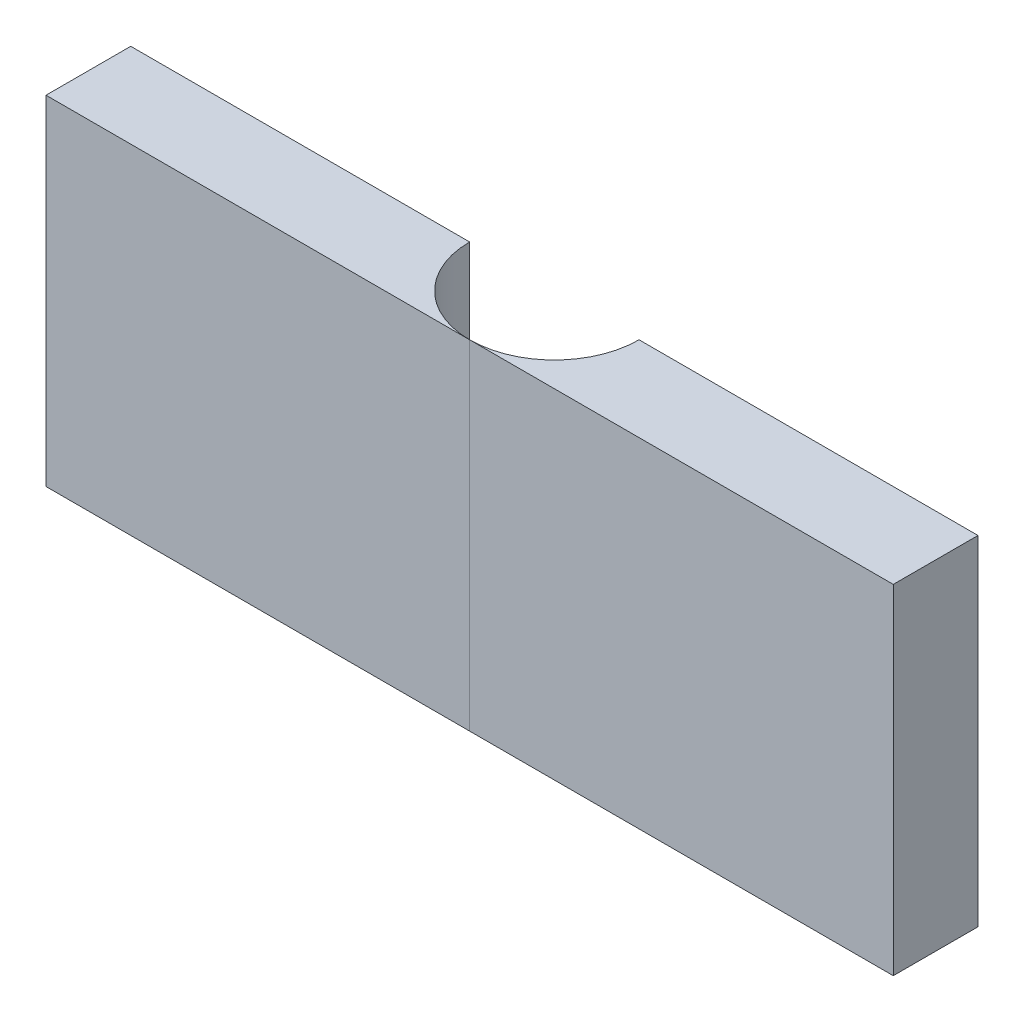
ISO-10303-21;
HEADER;
FILE_DESCRIPTION(('STEP AP214'),'2;1');
FILE_NAME('part.step','',(''),(''),'','','');
FILE_SCHEMA(('AUTOMOTIVE_DESIGN { 1 0 10303 214 1 1 1 1 }'));
ENDSEC;
DATA;
#1=APPLICATION_CONTEXT('core data for automotive mechanical design processes');
#2=APPLICATION_PROTOCOL_DEFINITION('international standard','automotive_design',2000,#1);
#3=PRODUCT_CONTEXT('',#1,'mechanical');
#4=PRODUCT('Part','Part','',(#3));
#5=PRODUCT_RELATED_PRODUCT_CATEGORY('part','',(#4));
#6=PRODUCT_DEFINITION_FORMATION('','',#4);
#7=PRODUCT_DEFINITION_CONTEXT('part definition',#1,'design');
#8=PRODUCT_DEFINITION('design','',#6,#7);
#9=PRODUCT_DEFINITION_SHAPE('','',#8);
#10=(LENGTH_UNIT() NAMED_UNIT(*) SI_UNIT(.MILLI.,.METRE.));
#11=(NAMED_UNIT(*) PLANE_ANGLE_UNIT() SI_UNIT($,.RADIAN.));
#12=(NAMED_UNIT(*) SI_UNIT($,.STERADIAN.) SOLID_ANGLE_UNIT());
#13=UNCERTAINTY_MEASURE_WITH_UNIT(LENGTH_MEASURE(1.E-05),#10,'distance_accuracy_value','');
#14=(GEOMETRIC_REPRESENTATION_CONTEXT(3) GLOBAL_UNCERTAINTY_ASSIGNED_CONTEXT((#13)) GLOBAL_UNIT_ASSIGNED_CONTEXT((#10,
#11,#12)) REPRESENTATION_CONTEXT('',''));
#15=CARTESIAN_POINT('',(0.,0.,0.));
#16=DIRECTION('',(0.,0.,1.));
#17=DIRECTION('',(1.,0.,0.));
#18=AXIS2_PLACEMENT_3D('',#15,#16,#17);
#19=CARTESIAN_POINT('',(0.,-20.,0.));
#20=DIRECTION('',(0.,1.,0.));
#21=DIRECTION('',(0.,0.,1.));
#22=AXIS2_PLACEMENT_3D('',#19,#20,#21);
#23=PLANE('',#22);
#24=DIRECTION('',(1.,0.,0.));
#25=VECTOR('',#24,1.);
#26=CARTESIAN_POINT('',(-25.,-20.,2.5));
#27=LINE('',#26,#25);
#28=CARTESIAN_POINT('',(0.,-20.,2.5));
#29=VERTEX_POINT('',#28);
#30=CARTESIAN_POINT('',(25.,-20.,2.5));
#31=VERTEX_POINT('',#30);
#32=EDGE_CURVE('E90',#29,#31,#27,.T.);
#33=ORIENTED_EDGE('',*,*,#32,.F.);
#34=CARTESIAN_POINT('',(0.,-20.,-2.5));
#35=DIRECTION('',(0.,1.,0.));
#36=DIRECTION('',(0.,0.,-1.));
#37=AXIS2_PLACEMENT_3D('',#34,#35,#36);
#38=CIRCLE('',#37,5.);
#39=CARTESIAN_POINT('',(5.,-20.,-2.5));
#40=VERTEX_POINT('',#39);
#41=EDGE_CURVE('E53',#29,#40,#38,.T.);
#42=ORIENTED_EDGE('',*,*,#41,.T.);
#43=DIRECTION('',(-1.,0.,0.));
#44=VECTOR('',#43,1.);
#45=CARTESIAN_POINT('',(-25.,-20.,-2.5));
#46=LINE('',#45,#44);
#47=CARTESIAN_POINT('',(25.,-20.,-2.5));
#48=VERTEX_POINT('',#47);
#49=EDGE_CURVE('E111',#48,#40,#46,.T.);
#50=ORIENTED_EDGE('',*,*,#49,.F.);
#51=DIRECTION('',(0.,0.,-1.));
#52=VECTOR('',#51,1.);
#53=CARTESIAN_POINT('',(25.,-20.,-2.5));
#54=LINE('',#53,#52);
#55=EDGE_CURVE('E103',#31,#48,#54,.T.);
#56=ORIENTED_EDGE('',*,*,#55,.F.);
#57=EDGE_LOOP('',(#33,#42,#50,#56));
#58=FACE_BOUND('',#57,.T.);
#59=ADVANCED_FACE('F49',(#58),#23,.F.);
#60=CARTESIAN_POINT('',(0.,0.,0.));
#61=DIRECTION('',(0.,1.,0.));
#62=DIRECTION('',(0.,0.,1.));
#63=AXIS2_PLACEMENT_3D('',#60,#61,#62);
#64=PLANE('',#63);
#65=CARTESIAN_POINT('',(0.,0.,-2.5));
#66=DIRECTION('',(0.,1.,0.));
#67=DIRECTION('',(0.,0.,1.));
#68=AXIS2_PLACEMENT_3D('',#65,#66,#67);
#69=CIRCLE('',#68,5.);
#70=CARTESIAN_POINT('',(0.,0.,2.5));
#71=VERTEX_POINT('',#70);
#72=CARTESIAN_POINT('',(5.,0.,-2.5));
#73=VERTEX_POINT('',#72);
#74=EDGE_CURVE('E12',#71,#73,#69,.T.);
#75=ORIENTED_EDGE('',*,*,#74,.F.);
#76=DIRECTION('',(1.,0.,0.));
#77=VECTOR('',#76,1.);
#78=CARTESIAN_POINT('',(-25.,0.,2.5));
#79=LINE('',#78,#77);
#80=CARTESIAN_POINT('',(25.,0.,2.5));
#81=VERTEX_POINT('',#80);
#82=EDGE_CURVE('E127',#71,#81,#79,.T.);
#83=ORIENTED_EDGE('',*,*,#82,.T.);
#84=DIRECTION('',(0.,0.,-1.));
#85=VECTOR('',#84,1.);
#86=CARTESIAN_POINT('',(25.,0.,-2.5));
#87=LINE('',#86,#85);
#88=CARTESIAN_POINT('',(25.,0.,-2.5));
#89=VERTEX_POINT('',#88);
#90=EDGE_CURVE('E105',#81,#89,#87,.T.);
#91=ORIENTED_EDGE('',*,*,#90,.T.);
#92=DIRECTION('',(-1.,0.,0.));
#93=VECTOR('',#92,1.);
#94=CARTESIAN_POINT('',(-25.,0.,-2.5));
#95=LINE('',#94,#93);
#96=EDGE_CURVE('E113',#89,#73,#95,.T.);
#97=ORIENTED_EDGE('',*,*,#96,.T.);
#98=EDGE_LOOP('',(#75,#83,#91,#97));
#99=FACE_BOUND('',#98,.T.);
#100=ADVANCED_FACE('F135',(#99),#64,.T.);
#101=CARTESIAN_POINT('',(25.,-20.,-2.5));
#102=DIRECTION('',(1.,0.,0.));
#103=DIRECTION('',(0.,0.,-1.));
#104=AXIS2_PLACEMENT_3D('',#101,#102,#103);
#105=PLANE('',#104);
#106=ORIENTED_EDGE('',*,*,#90,.F.);
#107=DIRECTION('',(0.,1.,0.));
#108=VECTOR('',#107,1.);
#109=CARTESIAN_POINT('',(25.,-20.,2.5));
#110=LINE('',#109,#108);
#111=EDGE_CURVE('E93',#31,#81,#110,.T.);
#112=ORIENTED_EDGE('',*,*,#111,.F.);
#113=ORIENTED_EDGE('',*,*,#55,.T.);
#114=DIRECTION('',(0.,1.,0.));
#115=VECTOR('',#114,1.);
#116=CARTESIAN_POINT('',(25.,-20.,-2.5));
#117=LINE('',#116,#115);
#118=EDGE_CURVE('E98',#48,#89,#117,.T.);
#119=ORIENTED_EDGE('',*,*,#118,.T.);
#120=EDGE_LOOP('',(#106,#112,#113,#119));
#121=FACE_BOUND('',#120,.T.);
#122=ADVANCED_FACE('F102',(#121),#105,.T.);
#123=CARTESIAN_POINT('',(-25.,-20.,2.5));
#124=DIRECTION('',(0.,0.,1.));
#125=DIRECTION('',(1.,0.,0.));
#126=AXIS2_PLACEMENT_3D('',#123,#124,#125);
#127=PLANE('',#126);
#128=DIRECTION('',(0.,1.,0.));
#129=VECTOR('',#128,1.);
#130=CARTESIAN_POINT('',(0.,-20.,2.5));
#131=LINE('',#130,#129);
#132=EDGE_CURVE('E60',#29,#71,#131,.T.);
#133=ORIENTED_EDGE('',*,*,#132,.F.);
#134=ORIENTED_EDGE('',*,*,#32,.T.);
#135=ORIENTED_EDGE('',*,*,#111,.T.);
#136=ORIENTED_EDGE('',*,*,#82,.F.);
#137=EDGE_LOOP('',(#133,#134,#135,#136));
#138=FACE_BOUND('',#137,.T.);
#139=ADVANCED_FACE('F92',(#138),#127,.T.);
#140=CARTESIAN_POINT('',(-25.,-20.,-2.5));
#141=DIRECTION('',(0.,0.,-1.));
#142=DIRECTION('',(-1.,0.,0.));
#143=AXIS2_PLACEMENT_3D('',#140,#141,#142);
#144=PLANE('',#143);
#145=DIRECTION('',(0.,1.,0.));
#146=VECTOR('',#145,1.);
#147=CARTESIAN_POINT('',(5.,-20.,-2.5));
#148=LINE('',#147,#146);
#149=EDGE_CURVE('E107',#40,#73,#148,.T.);
#150=ORIENTED_EDGE('',*,*,#149,.T.);
#151=ORIENTED_EDGE('',*,*,#96,.F.);
#152=ORIENTED_EDGE('',*,*,#118,.F.);
#153=ORIENTED_EDGE('',*,*,#49,.T.);
#154=EDGE_LOOP('',(#150,#151,#152,#153));
#155=FACE_BOUND('',#154,.T.);
#156=ADVANCED_FACE('F133',(#155),#144,.T.);
#157=CARTESIAN_POINT('',(0.,-20.,-2.5));
#158=DIRECTION('',(0.,1.,0.));
#159=DIRECTION('',(0.,0.,1.));
#160=AXIS2_PLACEMENT_3D('',#157,#158,#159);
#161=CYLINDRICAL_SURFACE('',#160,5.);
#162=ORIENTED_EDGE('',*,*,#132,.T.);
#163=ORIENTED_EDGE('',*,*,#74,.T.);
#164=ORIENTED_EDGE('',*,*,#149,.F.);
#165=ORIENTED_EDGE('',*,*,#41,.F.);
#166=EDGE_LOOP('',(#162,#163,#164,#165));
#167=FACE_BOUND('',#166,.T.);
#168=ADVANCED_FACE('F51',(#167),#161,.F.);
#169=CLOSED_SHELL('',(#59,#100,#122,#139,#156,#168));
#170=MANIFOLD_SOLID_BREP('B2',#169);
#171=CARTESIAN_POINT('',(-25.,-20.,-2.5));
#172=DIRECTION('',(-1.,0.,0.));
#173=DIRECTION('',(0.,0.,1.));
#174=AXIS2_PLACEMENT_3D('',#171,#172,#173);
#175=PLANE('',#174);
#176=DIRECTION('',(0.,0.,1.));
#177=VECTOR('',#176,1.);
#178=CARTESIAN_POINT('',(-25.,0.,-2.5));
#179=LINE('',#178,#177);
#180=CARTESIAN_POINT('',(-25.,0.,-2.5));
#181=VERTEX_POINT('',#180);
#182=CARTESIAN_POINT('',(-25.,0.,2.5));
#183=VERTEX_POINT('',#182);
#184=EDGE_CURVE('E246',#181,#183,#179,.T.);
#185=ORIENTED_EDGE('',*,*,#184,.F.);
#186=DIRECTION('',(0.,1.,0.));
#187=VECTOR('',#186,1.);
#188=CARTESIAN_POINT('',(-25.,-20.,-2.5));
#189=LINE('',#188,#187);
#190=CARTESIAN_POINT('',(-25.,-20.,-2.5));
#191=VERTEX_POINT('',#190);
#192=EDGE_CURVE('E189',#191,#181,#189,.T.);
#193=ORIENTED_EDGE('',*,*,#192,.F.);
#194=DIRECTION('',(0.,0.,1.));
#195=VECTOR('',#194,1.);
#196=CARTESIAN_POINT('',(-25.,-20.,-2.5));
#197=LINE('',#196,#195);
#198=CARTESIAN_POINT('',(-25.,-20.,2.5));
#199=VERTEX_POINT('',#198);
#200=EDGE_CURVE('E240',#191,#199,#197,.T.);
#201=ORIENTED_EDGE('',*,*,#200,.T.);
#202=DIRECTION('',(0.,1.,0.));
#203=VECTOR('',#202,1.);
#204=CARTESIAN_POINT('',(-25.,-20.,2.5));
#205=LINE('',#204,#203);
#206=EDGE_CURVE('E194',#199,#183,#205,.T.);
#207=ORIENTED_EDGE('',*,*,#206,.T.);
#208=EDGE_LOOP('',(#185,#193,#201,#207));
#209=FACE_BOUND('',#208,.T.);
#210=ADVANCED_FACE('F185',(#209),#175,.T.);
#211=CARTESIAN_POINT('',(0.,0.,0.));
#212=DIRECTION('',(0.,1.,0.));
#213=DIRECTION('',(0.,0.,1.));
#214=AXIS2_PLACEMENT_3D('',#211,#212,#213);
#215=PLANE('',#214);
#216=CARTESIAN_POINT('',(0.,0.,-2.5));
#217=DIRECTION('',(0.,1.,0.));
#218=DIRECTION('',(0.,0.,-1.));
#219=AXIS2_PLACEMENT_3D('',#216,#217,#218);
#220=CIRCLE('',#219,5.);
#221=CARTESIAN_POINT('',(-5.,0.,-2.5));
#222=VERTEX_POINT('',#221);
#223=CARTESIAN_POINT('',(0.,0.,2.5));
#224=VERTEX_POINT('',#223);
#225=EDGE_CURVE('E228',#222,#224,#220,.T.);
#226=ORIENTED_EDGE('',*,*,#225,.F.);
#227=DIRECTION('',(-1.,0.,0.));
#228=VECTOR('',#227,1.);
#229=CARTESIAN_POINT('',(-25.,0.,-2.5));
#230=LINE('',#229,#228);
#231=EDGE_CURVE('E235',#222,#181,#230,.T.);
#232=ORIENTED_EDGE('',*,*,#231,.T.);
#233=ORIENTED_EDGE('',*,*,#184,.T.);
#234=DIRECTION('',(1.,0.,0.));
#235=VECTOR('',#234,1.);
#236=CARTESIAN_POINT('',(-25.,0.,2.5));
#237=LINE('',#236,#235);
#238=EDGE_CURVE('E241',#183,#224,#237,.T.);
#239=ORIENTED_EDGE('',*,*,#238,.T.);
#240=EDGE_LOOP('',(#226,#232,#233,#239));
#241=FACE_BOUND('',#240,.T.);
#242=ADVANCED_FACE('F256',(#241),#215,.T.);
#243=CARTESIAN_POINT('',(0.,-20.,0.));
#244=DIRECTION('',(0.,1.,0.));
#245=DIRECTION('',(0.,0.,1.));
#246=AXIS2_PLACEMENT_3D('',#243,#244,#245);
#247=PLANE('',#246);
#248=DIRECTION('',(-1.,0.,0.));
#249=VECTOR('',#248,1.);
#250=CARTESIAN_POINT('',(-25.,-20.,-2.5));
#251=LINE('',#250,#249);
#252=CARTESIAN_POINT('',(-5.,-20.,-2.5));
#253=VERTEX_POINT('',#252);
#254=EDGE_CURVE('E233',#253,#191,#251,.T.);
#255=ORIENTED_EDGE('',*,*,#254,.F.);
#256=CARTESIAN_POINT('',(0.,-20.,-2.5));
#257=DIRECTION('',(0.,1.,0.));
#258=DIRECTION('',(0.,0.,-1.));
#259=AXIS2_PLACEMENT_3D('',#256,#257,#258);
#260=CIRCLE('',#259,5.);
#261=CARTESIAN_POINT('',(0.,-20.,2.5));
#262=VERTEX_POINT('',#261);
#263=EDGE_CURVE('E223',#253,#262,#260,.T.);
#264=ORIENTED_EDGE('',*,*,#263,.T.);
#265=DIRECTION('',(1.,0.,0.));
#266=VECTOR('',#265,1.);
#267=CARTESIAN_POINT('',(-25.,-20.,2.5));
#268=LINE('',#267,#266);
#269=EDGE_CURVE('E243',#199,#262,#268,.T.);
#270=ORIENTED_EDGE('',*,*,#269,.F.);
#271=ORIENTED_EDGE('',*,*,#200,.F.);
#272=EDGE_LOOP('',(#255,#264,#270,#271));
#273=FACE_BOUND('',#272,.T.);
#274=ADVANCED_FACE('F238',(#273),#247,.F.);
#275=CARTESIAN_POINT('',(-25.,-20.,-2.5));
#276=DIRECTION('',(0.,0.,-1.));
#277=DIRECTION('',(-1.,0.,0.));
#278=AXIS2_PLACEMENT_3D('',#275,#276,#277);
#279=PLANE('',#278);
#280=DIRECTION('',(0.,1.,0.));
#281=VECTOR('',#280,1.);
#282=CARTESIAN_POINT('',(-5.,-20.,-2.5));
#283=LINE('',#282,#281);
#284=EDGE_CURVE('E205',#253,#222,#283,.T.);
#285=ORIENTED_EDGE('',*,*,#284,.F.);
#286=ORIENTED_EDGE('',*,*,#254,.T.);
#287=ORIENTED_EDGE('',*,*,#192,.T.);
#288=ORIENTED_EDGE('',*,*,#231,.F.);
#289=EDGE_LOOP('',(#285,#286,#287,#288));
#290=FACE_BOUND('',#289,.T.);
#291=ADVANCED_FACE('F187',(#290),#279,.T.);
#292=CARTESIAN_POINT('',(-25.,-20.,2.5));
#293=DIRECTION('',(0.,0.,1.));
#294=DIRECTION('',(1.,0.,0.));
#295=AXIS2_PLACEMENT_3D('',#292,#293,#294);
#296=PLANE('',#295);
#297=ORIENTED_EDGE('',*,*,#269,.T.);
#298=DIRECTION('',(0.,1.,0.));
#299=VECTOR('',#298,1.);
#300=CARTESIAN_POINT('',(0.,-20.,2.5));
#301=LINE('',#300,#299);
#302=EDGE_CURVE('E47',#262,#224,#301,.T.);
#303=ORIENTED_EDGE('',*,*,#302,.T.);
#304=ORIENTED_EDGE('',*,*,#238,.F.);
#305=ORIENTED_EDGE('',*,*,#206,.F.);
#306=EDGE_LOOP('',(#297,#303,#304,#305));
#307=FACE_BOUND('',#306,.T.);
#308=ADVANCED_FACE('F258',(#307),#296,.T.);
#309=CARTESIAN_POINT('',(0.,-20.,-2.5));
#310=DIRECTION('',(0.,1.,0.));
#311=DIRECTION('',(0.,0.,1.));
#312=AXIS2_PLACEMENT_3D('',#309,#310,#311);
#313=CYLINDRICAL_SURFACE('',#312,5.);
#314=ORIENTED_EDGE('',*,*,#263,.F.);
#315=ORIENTED_EDGE('',*,*,#284,.T.);
#316=ORIENTED_EDGE('',*,*,#225,.T.);
#317=ORIENTED_EDGE('',*,*,#302,.F.);
#318=EDGE_LOOP('',(#314,#315,#316,#317));
#319=FACE_BOUND('',#318,.T.);
#320=ADVANCED_FACE('F224',(#319),#313,.F.);
#321=CLOSED_SHELL('',(#210,#242,#274,#291,#308,#320));
#322=MANIFOLD_SOLID_BREP('B6',#321);
#323=ADVANCED_BREP_SHAPE_REPRESENTATION('',(#18,#170,#322),#14);
#324=SHAPE_DEFINITION_REPRESENTATION(#9,#323);
ENDSEC;
END-ISO-10303-21;
